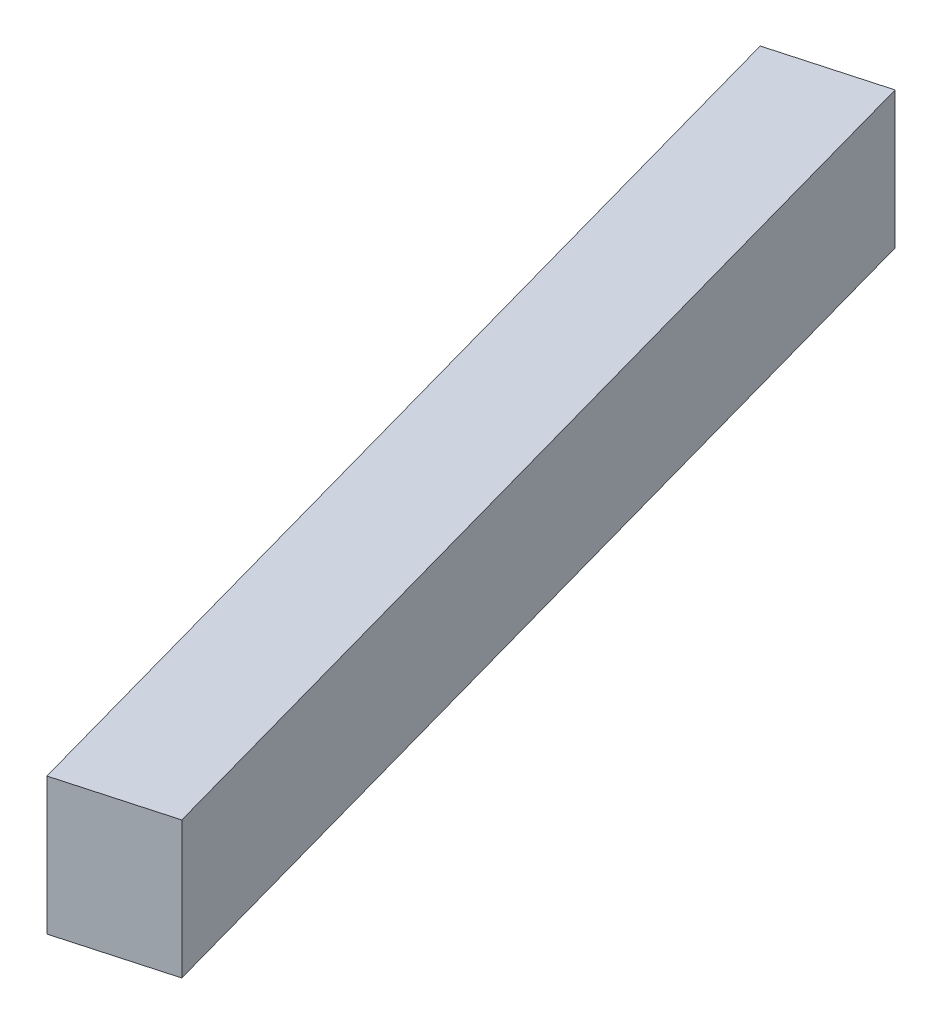
ISO-10303-21;
HEADER;
FILE_DESCRIPTION(('STEP AP214'),'2;1');
FILE_NAME('part.step','',(''),(''),'','','');
FILE_SCHEMA(('AUTOMOTIVE_DESIGN { 1 0 10303 214 1 1 1 1 }'));
ENDSEC;
DATA;
#1=APPLICATION_CONTEXT('core data for automotive mechanical design processes');
#2=APPLICATION_PROTOCOL_DEFINITION('international standard','automotive_design',2000,#1);
#3=PRODUCT_CONTEXT('',#1,'mechanical');
#4=PRODUCT('Part','Part','',(#3));
#5=PRODUCT_RELATED_PRODUCT_CATEGORY('part','',(#4));
#6=PRODUCT_DEFINITION_FORMATION('','',#4);
#7=PRODUCT_DEFINITION_CONTEXT('part definition',#1,'design');
#8=PRODUCT_DEFINITION('design','',#6,#7);
#9=PRODUCT_DEFINITION_SHAPE('','',#8);
#10=(LENGTH_UNIT() NAMED_UNIT(*) SI_UNIT(.MILLI.,.METRE.));
#11=(NAMED_UNIT(*) PLANE_ANGLE_UNIT() SI_UNIT($,.RADIAN.));
#12=(NAMED_UNIT(*) SI_UNIT($,.STERADIAN.) SOLID_ANGLE_UNIT());
#13=UNCERTAINTY_MEASURE_WITH_UNIT(LENGTH_MEASURE(1.E-05),#10,'distance_accuracy_value','');
#14=(GEOMETRIC_REPRESENTATION_CONTEXT(3) GLOBAL_UNCERTAINTY_ASSIGNED_CONTEXT((#13)) GLOBAL_UNIT_ASSIGNED_CONTEXT((#10,
#11,#12)) REPRESENTATION_CONTEXT('',''));
#15=CARTESIAN_POINT('',(0.,0.,0.));
#16=DIRECTION('',(0.,0.,1.));
#17=DIRECTION('',(1.,0.,0.));
#18=AXIS2_PLACEMENT_3D('',#15,#16,#17);
#19=CARTESIAN_POINT('',(4.92896018090264,7.874,17.3099193866027));
#20=DIRECTION('',(-0.963296994278671,0.,0.268437890048476));
#21=DIRECTION('',(0.268437890048476,0.,0.963296994278671));
#22=AXIS2_PLACEMENT_3D('',#19,#20,#21);
#23=PLANE('',#22);
#24=DIRECTION('',(0.,1.,0.));
#25=VECTOR('',#24,1.);
#26=CARTESIAN_POINT('',(4.92896018090264,7.874,17.3099193866027));
#27=LINE('',#26,#25);
#28=CARTESIAN_POINT('',(4.92896018090264,7.62,17.3099193866027));
#29=VERTEX_POINT('',#28);
#30=CARTESIAN_POINT('',(4.92896018090264,7.874,17.3099193866027));
#31=VERTEX_POINT('',#30);
#32=EDGE_CURVE('E20',#29,#31,#27,.T.);
#33=ORIENTED_EDGE('',*,*,#32,.T.);
#34=DIRECTION('',(0.268437890048487,0.,0.963296994278668));
#35=VECTOR('',#34,1.);
#36=CARTESIAN_POINT('',(4.92896018090264,7.874,17.3099193866027));
#37=LINE('',#36,#35);
#38=CARTESIAN_POINT('',(5.44033436144499,7.874,19.1450001607035));
#39=VERTEX_POINT('',#38);
#40=EDGE_CURVE('E55',#31,#39,#37,.T.);
#41=ORIENTED_EDGE('',*,*,#40,.T.);
#42=DIRECTION('',(0.,1.,0.));
#43=VECTOR('',#42,1.);
#44=CARTESIAN_POINT('',(5.44033436144499,7.874,19.1450001607035));
#45=LINE('',#44,#43);
#46=CARTESIAN_POINT('',(5.44033436144498,7.62,19.1450001607035));
#47=VERTEX_POINT('',#46);
#48=EDGE_CURVE('E76',#39,#47,#45,.F.);
#49=ORIENTED_EDGE('',*,*,#48,.T.);
#50=DIRECTION('',(0.268437890048487,0.,0.963296994278668));
#51=VECTOR('',#50,1.);
#52=CARTESIAN_POINT('',(4.92896018090264,7.62,17.3099193866027));
#53=LINE('',#52,#51);
#54=EDGE_CURVE('E58',#29,#47,#53,.T.);
#55=ORIENTED_EDGE('',*,*,#54,.F.);
#56=EDGE_LOOP('',(#33,#41,#49,#55));
#57=FACE_BOUND('',#56,.T.);
#58=ADVANCED_FACE('F17',(#57),#23,.F.);
#59=CARTESIAN_POINT('',(4.92896018090264,7.874,17.3099193866027));
#60=DIRECTION('',(0.268437890048515,0.,0.96329699427866));
#61=DIRECTION('',(0.96329699427866,0.,-0.268437890048515));
#62=AXIS2_PLACEMENT_3D('',#59,#60,#61);
#63=PLANE('',#62);
#64=DIRECTION('',(0.,1.,0.));
#65=VECTOR('',#64,1.);
#66=CARTESIAN_POINT('',(4.73321823166521,7.874,17.3644659658605));
#67=LINE('',#66,#65);
#68=CARTESIAN_POINT('',(4.73321823166522,7.62,17.3644659658605));
#69=VERTEX_POINT('',#68);
#70=CARTESIAN_POINT('',(4.73321823166522,7.874,17.3644659658605));
#71=VERTEX_POINT('',#70);
#72=EDGE_CURVE('E73',#69,#71,#67,.T.);
#73=ORIENTED_EDGE('',*,*,#72,.T.);
#74=DIRECTION('',(0.963296994278736,0.,-0.268437890048242));
#75=VECTOR('',#74,1.);
#76=CARTESIAN_POINT('',(4.73321823166521,7.874,17.3644659658605));
#77=LINE('',#76,#75);
#78=EDGE_CURVE('E63',#71,#31,#77,.T.);
#79=ORIENTED_EDGE('',*,*,#78,.T.);
#80=ORIENTED_EDGE('',*,*,#32,.F.);
#81=DIRECTION('',(0.963296994278736,0.,-0.268437890048242));
#82=VECTOR('',#81,1.);
#83=CARTESIAN_POINT('',(4.73321823166521,7.62,17.3644659658605));
#84=LINE('',#83,#82);
#85=EDGE_CURVE('E80',#69,#29,#84,.T.);
#86=ORIENTED_EDGE('',*,*,#85,.F.);
#87=EDGE_LOOP('',(#73,#79,#80,#86));
#88=FACE_BOUND('',#87,.T.);
#89=ADVANCED_FACE('F72',(#88),#63,.F.);
#90=CARTESIAN_POINT('',(4.92896018090264,7.874,17.3099193866027));
#91=DIRECTION('',(0.,-1.,0.));
#92=DIRECTION('',(0.,0.,-1.));
#93=AXIS2_PLACEMENT_3D('',#90,#91,#92);
#94=PLANE('',#93);
#95=ORIENTED_EDGE('',*,*,#78,.F.);
#96=DIRECTION('',(-0.268437890048477,0.,-0.963296994278671));
#97=VECTOR('',#96,1.);
#98=CARTESIAN_POINT('',(4.73321823166521,7.874,17.3644659658605));
#99=LINE('',#98,#97);
#100=CARTESIAN_POINT('',(5.2445924122906,7.874,19.1995467402594));
#101=VERTEX_POINT('',#100);
#102=EDGE_CURVE('E83',#71,#101,#99,.F.);
#103=ORIENTED_EDGE('',*,*,#102,.T.);
#104=DIRECTION('',(-0.963296993870018,0.,0.26843789151494));
#105=VECTOR('',#104,1.);
#106=CARTESIAN_POINT('',(5.44033436144499,7.874,19.1450001607035));
#107=LINE('',#106,#105);
#108=EDGE_CURVE('E69',#101,#39,#107,.F.);
#109=ORIENTED_EDGE('',*,*,#108,.T.);
#110=ORIENTED_EDGE('',*,*,#40,.F.);
#111=EDGE_LOOP('',(#95,#103,#109,#110));
#112=FACE_BOUND('',#111,.T.);
#113=ADVANCED_FACE('F66',(#112),#94,.F.);
#114=CARTESIAN_POINT('',(5.44033436144499,7.874,19.1450001607035));
#115=DIRECTION('',(-0.26843789151494,0.,-0.963296993870018));
#116=DIRECTION('',(-0.963296993870018,0.,0.26843789151494));
#117=AXIS2_PLACEMENT_3D('',#114,#115,#116);
#118=PLANE('',#117);
#119=ORIENTED_EDGE('',*,*,#48,.F.);
#120=ORIENTED_EDGE('',*,*,#108,.F.);
#121=DIRECTION('',(0.,1.,0.));
#122=VECTOR('',#121,1.);
#123=CARTESIAN_POINT('',(5.24459241229061,7.874,19.1995467402594));
#124=LINE('',#123,#122);
#125=CARTESIAN_POINT('',(5.24459241229059,7.62,19.1995467402594));
#126=VERTEX_POINT('',#125);
#127=EDGE_CURVE('E26',#101,#126,#124,.F.);
#128=ORIENTED_EDGE('',*,*,#127,.T.);
#129=DIRECTION('',(-0.963296993869939,0.,0.268437891515224));
#130=VECTOR('',#129,1.);
#131=CARTESIAN_POINT('',(5.44033436144499,7.62,19.1450001607035));
#132=LINE('',#131,#130);
#133=EDGE_CURVE('E34',#47,#126,#132,.T.);
#134=ORIENTED_EDGE('',*,*,#133,.F.);
#135=EDGE_LOOP('',(#119,#120,#128,#134));
#136=FACE_BOUND('',#135,.T.);
#137=ADVANCED_FACE('F88',(#136),#118,.F.);
#138=CARTESIAN_POINT('',(4.92896018090264,7.62,17.3099193866027));
#139=DIRECTION('',(0.,-1.,0.));
#140=DIRECTION('',(0.,0.,-1.));
#141=AXIS2_PLACEMENT_3D('',#138,#139,#140);
#142=PLANE('',#141);
#143=DIRECTION('',(-0.268437890048477,0.,-0.963296994278671));
#144=VECTOR('',#143,1.);
#145=CARTESIAN_POINT('',(4.73321823166521,7.62,17.3644659658605));
#146=LINE('',#145,#144);
#147=EDGE_CURVE('E11',#126,#69,#146,.T.);
#148=ORIENTED_EDGE('',*,*,#147,.T.);
#149=ORIENTED_EDGE('',*,*,#85,.T.);
#150=ORIENTED_EDGE('',*,*,#54,.T.);
#151=ORIENTED_EDGE('',*,*,#133,.T.);
#152=EDGE_LOOP('',(#148,#149,#150,#151));
#153=FACE_BOUND('',#152,.T.);
#154=ADVANCED_FACE('F91',(#153),#142,.T.);
#155=CARTESIAN_POINT('',(4.73321823166521,7.874,17.3644659658605));
#156=DIRECTION('',(0.963296994278671,0.,-0.268437890048477));
#157=DIRECTION('',(-0.268437890048477,0.,-0.963296994278671));
#158=AXIS2_PLACEMENT_3D('',#155,#156,#157);
#159=PLANE('',#158);
#160=ORIENTED_EDGE('',*,*,#127,.F.);
#161=ORIENTED_EDGE('',*,*,#102,.F.);
#162=ORIENTED_EDGE('',*,*,#72,.F.);
#163=ORIENTED_EDGE('',*,*,#147,.F.);
#164=EDGE_LOOP('',(#160,#161,#162,#163));
#165=FACE_BOUND('',#164,.T.);
#166=ADVANCED_FACE('F90',(#165),#159,.F.);
#167=CLOSED_SHELL('',(#58,#89,#113,#137,#154,#166));
#168=MANIFOLD_SOLID_BREP('B1',#167);
#169=ADVANCED_BREP_SHAPE_REPRESENTATION('',(#18,#168),#14);
#170=SHAPE_DEFINITION_REPRESENTATION(#9,#169);
ENDSEC;
END-ISO-10303-21;
